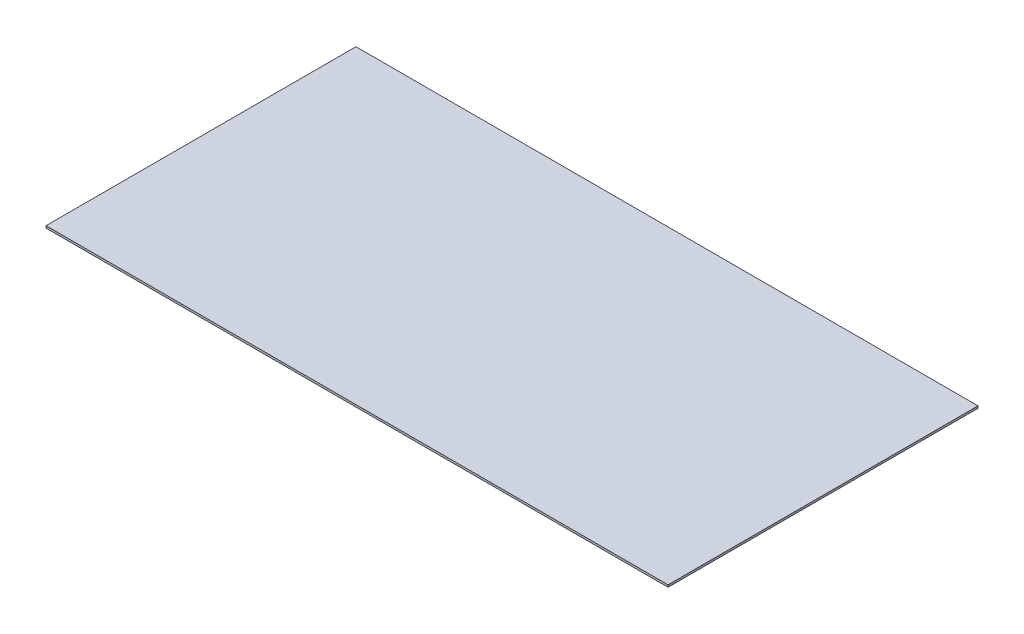
ISO-10303-21;
HEADER;
FILE_DESCRIPTION(('STEP AP214'),'2;1');
FILE_NAME('part.step','',(''),(''),'','','');
FILE_SCHEMA(('AUTOMOTIVE_DESIGN { 1 0 10303 214 1 1 1 1 }'));
ENDSEC;
DATA;
#1=APPLICATION_CONTEXT('core data for automotive mechanical design processes');
#2=APPLICATION_PROTOCOL_DEFINITION('international standard','automotive_design',2000,#1);
#3=PRODUCT_CONTEXT('',#1,'mechanical');
#4=PRODUCT('Part','Part','',(#3));
#5=PRODUCT_RELATED_PRODUCT_CATEGORY('part','',(#4));
#6=PRODUCT_DEFINITION_FORMATION('','',#4);
#7=PRODUCT_DEFINITION_CONTEXT('part definition',#1,'design');
#8=PRODUCT_DEFINITION('design','',#6,#7);
#9=PRODUCT_DEFINITION_SHAPE('','',#8);
#10=(LENGTH_UNIT() NAMED_UNIT(*) SI_UNIT(.MILLI.,.METRE.));
#11=(NAMED_UNIT(*) PLANE_ANGLE_UNIT() SI_UNIT($,.RADIAN.));
#12=(NAMED_UNIT(*) SI_UNIT($,.STERADIAN.) SOLID_ANGLE_UNIT());
#13=UNCERTAINTY_MEASURE_WITH_UNIT(LENGTH_MEASURE(1.E-05),#10,'distance_accuracy_value','');
#14=(GEOMETRIC_REPRESENTATION_CONTEXT(3) GLOBAL_UNCERTAINTY_ASSIGNED_CONTEXT((#13)) GLOBAL_UNIT_ASSIGNED_CONTEXT((#10,
#11,#12)) REPRESENTATION_CONTEXT('',''));
#15=CARTESIAN_POINT('',(0.,0.,0.));
#16=DIRECTION('',(0.,0.,1.));
#17=DIRECTION('',(1.,0.,0.));
#18=AXIS2_PLACEMENT_3D('',#15,#16,#17);
#19=CARTESIAN_POINT('',(-437.499999999999,3.,-218.));
#20=DIRECTION('',(1.,0.,0.));
#21=DIRECTION('',(0.,0.,-1.));
#22=AXIS2_PLACEMENT_3D('',#19,#20,#21);
#23=PLANE('',#22);
#24=DIRECTION('',(0.,0.,1.));
#25=VECTOR('',#24,1.);
#26=CARTESIAN_POINT('',(-437.499999999999,0.,-218.));
#27=LINE('',#26,#25);
#28=CARTESIAN_POINT('',(-437.499999999999,0.,-218.));
#29=VERTEX_POINT('',#28);
#30=CARTESIAN_POINT('',(-437.499999999999,0.,218.));
#31=VERTEX_POINT('',#30);
#32=EDGE_CURVE('E96',#29,#31,#27,.T.);
#33=ORIENTED_EDGE('',*,*,#32,.T.);
#34=DIRECTION('',(0.,-1.,0.));
#35=VECTOR('',#34,1.);
#36=CARTESIAN_POINT('',(-437.499999999999,3.,218.));
#37=LINE('',#36,#35);
#38=CARTESIAN_POINT('',(-437.499999999999,3.,218.));
#39=VERTEX_POINT('',#38);
#40=EDGE_CURVE('E11',#39,#31,#37,.T.);
#41=ORIENTED_EDGE('',*,*,#40,.F.);
#42=DIRECTION('',(0.,0.,1.));
#43=VECTOR('',#42,1.);
#44=CARTESIAN_POINT('',(-437.499999999999,3.,-218.));
#45=LINE('',#44,#43);
#46=CARTESIAN_POINT('',(-437.499999999999,3.,-218.));
#47=VERTEX_POINT('',#46);
#48=EDGE_CURVE('E84',#47,#39,#45,.T.);
#49=ORIENTED_EDGE('',*,*,#48,.F.);
#50=DIRECTION('',(0.,-1.,0.));
#51=VECTOR('',#50,1.);
#52=CARTESIAN_POINT('',(-437.499999999999,3.,-218.));
#53=LINE('',#52,#51);
#54=EDGE_CURVE('E92',#47,#29,#53,.T.);
#55=ORIENTED_EDGE('',*,*,#54,.T.);
#56=EDGE_LOOP('',(#33,#41,#49,#55));
#57=FACE_BOUND('',#56,.T.);
#58=ADVANCED_FACE('F33',(#57),#23,.F.);
#59=CARTESIAN_POINT('',(-437.499999999999,3.,218.));
#60=DIRECTION('',(0.,0.,-1.));
#61=DIRECTION('',(-1.,0.,0.));
#62=AXIS2_PLACEMENT_3D('',#59,#60,#61);
#63=PLANE('',#62);
#64=DIRECTION('',(1.,0.,0.));
#65=VECTOR('',#64,1.);
#66=CARTESIAN_POINT('',(-437.499999999999,0.,218.));
#67=LINE('',#66,#65);
#68=CARTESIAN_POINT('',(437.499999999999,0.,218.));
#69=VERTEX_POINT('',#68);
#70=EDGE_CURVE('E88',#31,#69,#67,.T.);
#71=ORIENTED_EDGE('',*,*,#70,.T.);
#72=DIRECTION('',(0.,-1.,0.));
#73=VECTOR('',#72,1.);
#74=CARTESIAN_POINT('',(437.499999999999,3.,218.));
#75=LINE('',#74,#73);
#76=CARTESIAN_POINT('',(437.499999999999,3.,218.));
#77=VERTEX_POINT('',#76);
#78=EDGE_CURVE('E41',#77,#69,#75,.T.);
#79=ORIENTED_EDGE('',*,*,#78,.F.);
#80=DIRECTION('',(1.,0.,0.));
#81=VECTOR('',#80,1.);
#82=CARTESIAN_POINT('',(-437.499999999999,3.,218.));
#83=LINE('',#82,#81);
#84=EDGE_CURVE('E79',#39,#77,#83,.T.);
#85=ORIENTED_EDGE('',*,*,#84,.F.);
#86=ORIENTED_EDGE('',*,*,#40,.T.);
#87=EDGE_LOOP('',(#71,#79,#85,#86));
#88=FACE_BOUND('',#87,.T.);
#89=ADVANCED_FACE('F87',(#88),#63,.F.);
#90=CARTESIAN_POINT('',(437.499999999999,3.,-218.));
#91=DIRECTION('',(-1.,0.,0.));
#92=DIRECTION('',(0.,0.,1.));
#93=AXIS2_PLACEMENT_3D('',#90,#91,#92);
#94=PLANE('',#93);
#95=DIRECTION('',(0.,0.,-1.));
#96=VECTOR('',#95,1.);
#97=CARTESIAN_POINT('',(437.499999999999,0.,-218.));
#98=LINE('',#97,#96);
#99=CARTESIAN_POINT('',(437.499999999999,0.,-218.));
#100=VERTEX_POINT('',#99);
#101=EDGE_CURVE('E66',#69,#100,#98,.T.);
#102=ORIENTED_EDGE('',*,*,#101,.T.);
#103=DIRECTION('',(0.,-1.,0.));
#104=VECTOR('',#103,1.);
#105=CARTESIAN_POINT('',(437.499999999999,3.,-218.));
#106=LINE('',#105,#104);
#107=CARTESIAN_POINT('',(437.499999999999,3.,-218.));
#108=VERTEX_POINT('',#107);
#109=EDGE_CURVE('E89',#108,#100,#106,.T.);
#110=ORIENTED_EDGE('',*,*,#109,.F.);
#111=DIRECTION('',(0.,0.,-1.));
#112=VECTOR('',#111,1.);
#113=CARTESIAN_POINT('',(437.499999999999,3.,-218.));
#114=LINE('',#113,#112);
#115=EDGE_CURVE('E82',#77,#108,#114,.T.);
#116=ORIENTED_EDGE('',*,*,#115,.F.);
#117=ORIENTED_EDGE('',*,*,#78,.T.);
#118=EDGE_LOOP('',(#102,#110,#116,#117));
#119=FACE_BOUND('',#118,.T.);
#120=ADVANCED_FACE('F90',(#119),#94,.F.);
#121=CARTESIAN_POINT('',(-437.499999999999,3.,-218.));
#122=DIRECTION('',(0.,0.,1.));
#123=DIRECTION('',(1.,0.,0.));
#124=AXIS2_PLACEMENT_3D('',#121,#122,#123);
#125=PLANE('',#124);
#126=DIRECTION('',(-1.,0.,0.));
#127=VECTOR('',#126,1.);
#128=CARTESIAN_POINT('',(-437.499999999999,0.,-218.));
#129=LINE('',#128,#127);
#130=EDGE_CURVE('E72',#100,#29,#129,.T.);
#131=ORIENTED_EDGE('',*,*,#130,.T.);
#132=ORIENTED_EDGE('',*,*,#54,.F.);
#133=DIRECTION('',(-1.,0.,0.));
#134=VECTOR('',#133,1.);
#135=CARTESIAN_POINT('',(-437.499999999999,3.,-218.));
#136=LINE('',#135,#134);
#137=EDGE_CURVE('E49',#108,#47,#136,.T.);
#138=ORIENTED_EDGE('',*,*,#137,.F.);
#139=ORIENTED_EDGE('',*,*,#109,.T.);
#140=EDGE_LOOP('',(#131,#132,#138,#139));
#141=FACE_BOUND('',#140,.T.);
#142=ADVANCED_FACE('F103',(#141),#125,.F.);
#143=CARTESIAN_POINT('',(0.,3.,0.));
#144=DIRECTION('',(0.,1.,0.));
#145=DIRECTION('',(0.,0.,1.));
#146=AXIS2_PLACEMENT_3D('',#143,#144,#145);
#147=PLANE('',#146);
#148=ORIENTED_EDGE('',*,*,#48,.T.);
#149=ORIENTED_EDGE('',*,*,#84,.T.);
#150=ORIENTED_EDGE('',*,*,#115,.T.);
#151=ORIENTED_EDGE('',*,*,#137,.T.);
#152=EDGE_LOOP('',(#148,#149,#150,#151));
#153=FACE_BOUND('',#152,.T.);
#154=ADVANCED_FACE('F80',(#153),#147,.T.);
#155=CARTESIAN_POINT('',(0.,0.,0.));
#156=DIRECTION('',(0.,1.,0.));
#157=DIRECTION('',(0.,0.,1.));
#158=AXIS2_PLACEMENT_3D('',#155,#156,#157);
#159=PLANE('',#158);
#160=ORIENTED_EDGE('',*,*,#32,.F.);
#161=ORIENTED_EDGE('',*,*,#130,.F.);
#162=ORIENTED_EDGE('',*,*,#101,.F.);
#163=ORIENTED_EDGE('',*,*,#70,.F.);
#164=EDGE_LOOP('',(#160,#161,#162,#163));
#165=FACE_BOUND('',#164,.T.);
#166=ADVANCED_FACE('F106',(#165),#159,.F.);
#167=CLOSED_SHELL('',(#58,#89,#120,#142,#154,#166));
#168=MANIFOLD_SOLID_BREP('B2',#167);
#169=ADVANCED_BREP_SHAPE_REPRESENTATION('',(#18,#168),#14);
#170=SHAPE_DEFINITION_REPRESENTATION(#9,#169);
ENDSEC;
END-ISO-10303-21;
